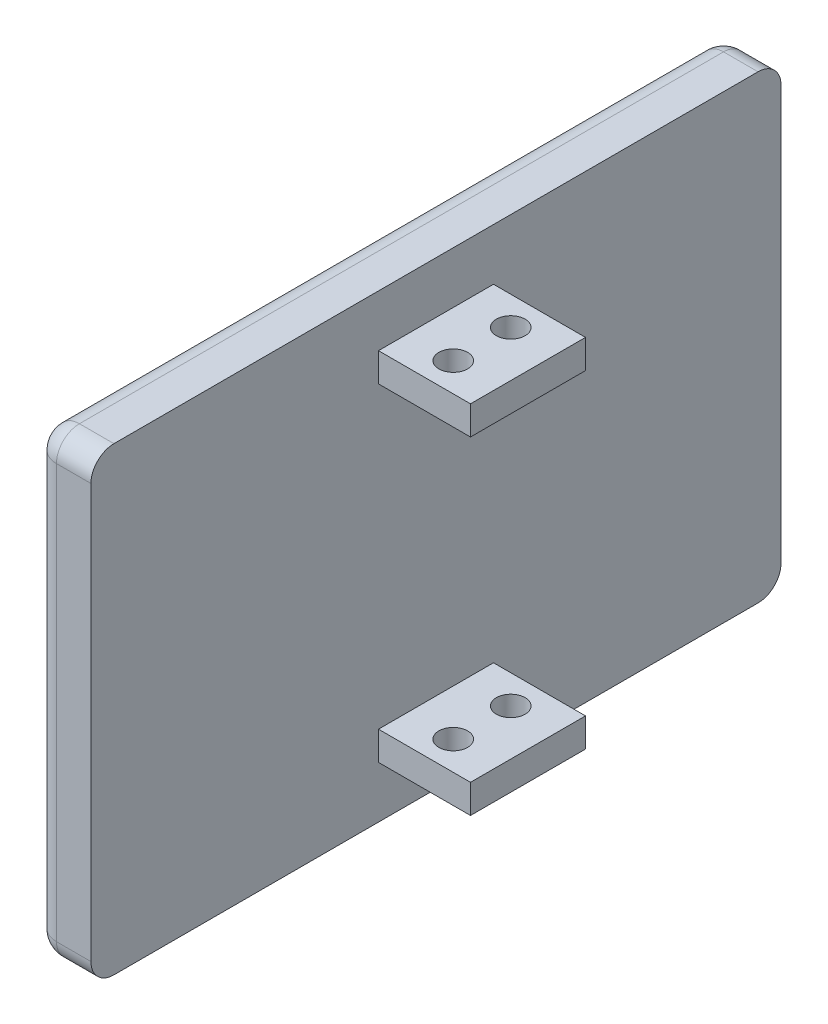
ISO-10303-21;
HEADER;
FILE_DESCRIPTION(('STEP AP214'),'2;1');
FILE_NAME('part.step','',(''),(''),'','','');
FILE_SCHEMA(('AUTOMOTIVE_DESIGN { 1 0 10303 214 1 1 1 1 }'));
ENDSEC;
DATA;
#1=APPLICATION_CONTEXT('core data for automotive mechanical design processes');
#2=APPLICATION_PROTOCOL_DEFINITION('international standard','automotive_design',2000,#1);
#3=PRODUCT_CONTEXT('',#1,'mechanical');
#4=PRODUCT('Part','Part','',(#3));
#5=PRODUCT_RELATED_PRODUCT_CATEGORY('part','',(#4));
#6=PRODUCT_DEFINITION_FORMATION('','',#4);
#7=PRODUCT_DEFINITION_CONTEXT('part definition',#1,'design');
#8=PRODUCT_DEFINITION('design','',#6,#7);
#9=PRODUCT_DEFINITION_SHAPE('','',#8);
#10=(LENGTH_UNIT() NAMED_UNIT(*) SI_UNIT(.MILLI.,.METRE.));
#11=(NAMED_UNIT(*) PLANE_ANGLE_UNIT() SI_UNIT($,.RADIAN.));
#12=(NAMED_UNIT(*) SI_UNIT($,.STERADIAN.) SOLID_ANGLE_UNIT());
#13=UNCERTAINTY_MEASURE_WITH_UNIT(LENGTH_MEASURE(1.E-05),#10,'distance_accuracy_value','');
#14=(GEOMETRIC_REPRESENTATION_CONTEXT(3) GLOBAL_UNCERTAINTY_ASSIGNED_CONTEXT((#13)) GLOBAL_UNIT_ASSIGNED_CONTEXT((#10,
#11,#12)) REPRESENTATION_CONTEXT('',''));
#15=CARTESIAN_POINT('',(0.,0.,0.));
#16=DIRECTION('',(0.,0.,1.));
#17=DIRECTION('',(1.,0.,0.));
#18=AXIS2_PLACEMENT_3D('',#15,#16,#17);
#19=CARTESIAN_POINT('',(6.35,0.,0.));
#20=DIRECTION('',(1.,0.,0.));
#21=DIRECTION('',(0.,0.,-1.));
#22=AXIS2_PLACEMENT_3D('',#19,#20,#21);
#23=PLANE('',#22);
#24=DIRECTION('',(0.,1.,0.));
#25=VECTOR('',#24,1.);
#26=CARTESIAN_POINT('',(6.35,-25.4,-38.1));
#27=LINE('',#26,#25);
#28=CARTESIAN_POINT('',(6.35,-22.86,-38.1));
#29=VERTEX_POINT('',#28);
#30=CARTESIAN_POINT('',(6.35,22.86,-38.1));
#31=VERTEX_POINT('',#30);
#32=EDGE_CURVE('E230',#29,#31,#27,.T.);
#33=ORIENTED_EDGE('',*,*,#32,.T.);
#34=CARTESIAN_POINT('',(6.35,22.86,-35.56));
#35=DIRECTION('',(1.,0.,0.));
#36=DIRECTION('',(0.,0.,-1.));
#37=AXIS2_PLACEMENT_3D('',#34,#35,#36);
#38=CIRCLE('',#37,2.54);
#39=CARTESIAN_POINT('',(6.35,25.4,-35.56));
#40=VERTEX_POINT('',#39);
#41=EDGE_CURVE('E11',#31,#40,#38,.T.);
#42=ORIENTED_EDGE('',*,*,#41,.T.);
#43=DIRECTION('',(0.,0.,1.));
#44=VECTOR('',#43,1.);
#45=CARTESIAN_POINT('',(6.35,25.4,-38.1));
#46=LINE('',#45,#44);
#47=CARTESIAN_POINT('',(6.35,25.4,35.56));
#48=VERTEX_POINT('',#47);
#49=EDGE_CURVE('E233',#40,#48,#46,.T.);
#50=ORIENTED_EDGE('',*,*,#49,.T.);
#51=CARTESIAN_POINT('',(6.35,22.86,35.56));
#52=DIRECTION('',(1.,0.,0.));
#53=DIRECTION('',(0.,0.,-1.));
#54=AXIS2_PLACEMENT_3D('',#51,#52,#53);
#55=CIRCLE('',#54,2.54);
#56=CARTESIAN_POINT('',(6.35,22.86,38.1));
#57=VERTEX_POINT('',#56);
#58=EDGE_CURVE('E268',#48,#57,#55,.T.);
#59=ORIENTED_EDGE('',*,*,#58,.T.);
#60=DIRECTION('',(0.,-1.,0.));
#61=VECTOR('',#60,1.);
#62=CARTESIAN_POINT('',(6.35,-25.4,38.1));
#63=LINE('',#62,#61);
#64=CARTESIAN_POINT('',(6.35,-22.86,38.1));
#65=VERTEX_POINT('',#64);
#66=EDGE_CURVE('E224',#57,#65,#63,.T.);
#67=ORIENTED_EDGE('',*,*,#66,.T.);
#68=CARTESIAN_POINT('',(6.35,-22.86,35.56));
#69=DIRECTION('',(1.,0.,0.));
#70=DIRECTION('',(0.,0.,-1.));
#71=AXIS2_PLACEMENT_3D('',#68,#69,#70);
#72=CIRCLE('',#71,2.54);
#73=CARTESIAN_POINT('',(6.35,-25.4,35.56));
#74=VERTEX_POINT('',#73);
#75=EDGE_CURVE('E270',#65,#74,#72,.T.);
#76=ORIENTED_EDGE('',*,*,#75,.T.);
#77=DIRECTION('',(0.,0.,-1.));
#78=VECTOR('',#77,1.);
#79=CARTESIAN_POINT('',(6.35,-25.4,-38.1));
#80=LINE('',#79,#78);
#81=CARTESIAN_POINT('',(6.35,-25.4,-35.56));
#82=VERTEX_POINT('',#81);
#83=EDGE_CURVE('E227',#74,#82,#80,.T.);
#84=ORIENTED_EDGE('',*,*,#83,.T.);
#85=CARTESIAN_POINT('',(6.35,-22.86,-35.56));
#86=DIRECTION('',(1.,0.,0.));
#87=DIRECTION('',(0.,0.,-1.));
#88=AXIS2_PLACEMENT_3D('',#85,#86,#87);
#89=CIRCLE('',#88,2.54);
#90=EDGE_CURVE('E48',#82,#29,#89,.T.);
#91=ORIENTED_EDGE('',*,*,#90,.T.);
#92=EDGE_LOOP('',(#33,#42,#50,#59,#67,#76,#84,#91));
#93=FACE_BOUND('',#92,.T.);
#94=DIRECTION('',(0.,0.,-1.));
#95=VECTOR('',#94,1.);
#96=CARTESIAN_POINT('',(6.35,-19.685,6.35000000000001));
#97=LINE('',#96,#95);
#98=CARTESIAN_POINT('',(6.35,-19.685,6.35000000000001));
#99=VERTEX_POINT('',#98);
#100=CARTESIAN_POINT('',(6.35,-19.685,-6.34999999999999));
#101=VERTEX_POINT('',#100);
#102=EDGE_CURVE('E193',#99,#101,#97,.T.);
#103=ORIENTED_EDGE('',*,*,#102,.F.);
#104=DIRECTION('',(0.,-1.,0.));
#105=VECTOR('',#104,1.);
#106=CARTESIAN_POINT('',(6.35,-19.685,6.35000000000001));
#107=LINE('',#106,#105);
#108=CARTESIAN_POINT('',(6.35,-16.51,6.35000000000001));
#109=VERTEX_POINT('',#108);
#110=EDGE_CURVE('E190',#109,#99,#107,.T.);
#111=ORIENTED_EDGE('',*,*,#110,.F.);
#112=DIRECTION('',(0.,0.,1.));
#113=VECTOR('',#112,1.);
#114=CARTESIAN_POINT('',(6.35,-16.51,6.35000000000001));
#115=LINE('',#114,#113);
#116=CARTESIAN_POINT('',(6.35,-16.51,-6.34999999999999));
#117=VERTEX_POINT('',#116);
#118=EDGE_CURVE('E203',#117,#109,#115,.T.);
#119=ORIENTED_EDGE('',*,*,#118,.F.);
#120=DIRECTION('',(0.,1.,0.));
#121=VECTOR('',#120,1.);
#122=CARTESIAN_POINT('',(6.35,-19.685,-6.34999999999999));
#123=LINE('',#122,#121);
#124=EDGE_CURVE('E211',#101,#117,#123,.T.);
#125=ORIENTED_EDGE('',*,*,#124,.F.);
#126=EDGE_LOOP('',(#103,#111,#119,#125));
#127=FACE_BOUND('',#126,.T.);
#128=DIRECTION('',(0.,0.,-1.));
#129=VECTOR('',#128,1.);
#130=CARTESIAN_POINT('',(6.35,16.51,6.35000000000001));
#131=LINE('',#130,#129);
#132=CARTESIAN_POINT('',(6.35,16.51,6.35000000000001));
#133=VERTEX_POINT('',#132);
#134=CARTESIAN_POINT('',(6.35,16.51,-6.34999999999999));
#135=VERTEX_POINT('',#134);
#136=EDGE_CURVE('E307',#133,#135,#131,.T.);
#137=ORIENTED_EDGE('',*,*,#136,.F.);
#138=DIRECTION('',(0.,-1.,0.));
#139=VECTOR('',#138,1.);
#140=CARTESIAN_POINT('',(6.35,19.685,6.35000000000001));
#141=LINE('',#140,#139);
#142=CARTESIAN_POINT('',(6.35,19.685,6.35000000000001));
#143=VERTEX_POINT('',#142);
#144=EDGE_CURVE('E188',#143,#133,#141,.T.);
#145=ORIENTED_EDGE('',*,*,#144,.F.);
#146=DIRECTION('',(0.,0.,1.));
#147=VECTOR('',#146,1.);
#148=CARTESIAN_POINT('',(6.35,19.685,6.35000000000001));
#149=LINE('',#148,#147);
#150=CARTESIAN_POINT('',(6.35,19.685,-6.34999999999999));
#151=VERTEX_POINT('',#150);
#152=EDGE_CURVE('E184',#151,#143,#149,.T.);
#153=ORIENTED_EDGE('',*,*,#152,.F.);
#154=DIRECTION('',(0.,1.,0.));
#155=VECTOR('',#154,1.);
#156=CARTESIAN_POINT('',(6.35,19.685,-6.34999999999999));
#157=LINE('',#156,#155);
#158=EDGE_CURVE('E309',#135,#151,#157,.T.);
#159=ORIENTED_EDGE('',*,*,#158,.F.);
#160=EDGE_LOOP('',(#137,#145,#153,#159));
#161=FACE_BOUND('',#160,.T.);
#162=ADVANCED_FACE('F39',(#93,#127,#161),#23,.T.);
#163=CARTESIAN_POINT('',(6.35,-25.4,38.1));
#164=DIRECTION('',(0.,0.,-1.));
#165=DIRECTION('',(-1.,0.,0.));
#166=AXIS2_PLACEMENT_3D('',#163,#164,#165);
#167=PLANE('',#166);
#168=DIRECTION('',(0.,-1.,0.));
#169=VECTOR('',#168,1.);
#170=CARTESIAN_POINT('',(2.54,-25.4,38.1));
#171=LINE('',#170,#169);
#172=CARTESIAN_POINT('',(2.54,22.86,38.1));
#173=VERTEX_POINT('',#172);
#174=CARTESIAN_POINT('',(2.54,-22.86,38.1));
#175=VERTEX_POINT('',#174);
#176=EDGE_CURVE('E56',#173,#175,#171,.T.);
#177=ORIENTED_EDGE('',*,*,#176,.T.);
#178=DIRECTION('',(-1.,0.,0.));
#179=VECTOR('',#178,1.);
#180=CARTESIAN_POINT('',(6.35,-22.86,38.1));
#181=LINE('',#180,#179);
#182=EDGE_CURVE('E266',#175,#65,#181,.F.);
#183=ORIENTED_EDGE('',*,*,#182,.T.);
#184=ORIENTED_EDGE('',*,*,#66,.F.);
#185=DIRECTION('',(-1.,0.,0.));
#186=VECTOR('',#185,1.);
#187=CARTESIAN_POINT('',(6.35,22.86,38.1));
#188=LINE('',#187,#186);
#189=EDGE_CURVE('E61',#57,#173,#188,.T.);
#190=ORIENTED_EDGE('',*,*,#189,.T.);
#191=EDGE_LOOP('',(#177,#183,#184,#190));
#192=FACE_BOUND('',#191,.T.);
#193=ADVANCED_FACE('F327',(#192),#167,.F.);
#194=CARTESIAN_POINT('',(6.35,-25.4,-38.1));
#195=DIRECTION('',(0.,1.,0.));
#196=DIRECTION('',(0.,0.,1.));
#197=AXIS2_PLACEMENT_3D('',#194,#195,#196);
#198=PLANE('',#197);
#199=DIRECTION('',(0.,0.,-1.));
#200=VECTOR('',#199,1.);
#201=CARTESIAN_POINT('',(2.54,-25.4,-38.1));
#202=LINE('',#201,#200);
#203=CARTESIAN_POINT('',(2.54,-25.4,35.56));
#204=VERTEX_POINT('',#203);
#205=CARTESIAN_POINT('',(2.54,-25.4,-35.56));
#206=VERTEX_POINT('',#205);
#207=EDGE_CURVE('E238',#204,#206,#202,.T.);
#208=ORIENTED_EDGE('',*,*,#207,.T.);
#209=DIRECTION('',(-1.,0.,0.));
#210=VECTOR('',#209,1.);
#211=CARTESIAN_POINT('',(6.35,-25.4,-35.56));
#212=LINE('',#211,#210);
#213=EDGE_CURVE('E241',#206,#82,#212,.F.);
#214=ORIENTED_EDGE('',*,*,#213,.T.);
#215=ORIENTED_EDGE('',*,*,#83,.F.);
#216=DIRECTION('',(-1.,0.,0.));
#217=VECTOR('',#216,1.);
#218=CARTESIAN_POINT('',(6.35,-25.4,35.56));
#219=LINE('',#218,#217);
#220=EDGE_CURVE('E236',#74,#204,#219,.T.);
#221=ORIENTED_EDGE('',*,*,#220,.T.);
#222=EDGE_LOOP('',(#208,#214,#215,#221));
#223=FACE_BOUND('',#222,.T.);
#224=ADVANCED_FACE('F333',(#223),#198,.F.);
#225=CARTESIAN_POINT('',(6.35,-25.4,-38.1));
#226=DIRECTION('',(0.,0.,1.));
#227=DIRECTION('',(1.,0.,0.));
#228=AXIS2_PLACEMENT_3D('',#225,#226,#227);
#229=PLANE('',#228);
#230=DIRECTION('',(0.,1.,0.));
#231=VECTOR('',#230,1.);
#232=CARTESIAN_POINT('',(2.54,-25.4,-38.1));
#233=LINE('',#232,#231);
#234=CARTESIAN_POINT('',(2.54,-22.86,-38.1));
#235=VERTEX_POINT('',#234);
#236=CARTESIAN_POINT('',(2.54,22.86,-38.1));
#237=VERTEX_POINT('',#236);
#238=EDGE_CURVE('E254',#235,#237,#233,.T.);
#239=ORIENTED_EDGE('',*,*,#238,.T.);
#240=DIRECTION('',(-1.,0.,0.));
#241=VECTOR('',#240,1.);
#242=CARTESIAN_POINT('',(6.35,22.86,-38.1));
#243=LINE('',#242,#241);
#244=EDGE_CURVE('E256',#237,#31,#243,.F.);
#245=ORIENTED_EDGE('',*,*,#244,.T.);
#246=ORIENTED_EDGE('',*,*,#32,.F.);
#247=DIRECTION('',(-1.,0.,0.));
#248=VECTOR('',#247,1.);
#249=CARTESIAN_POINT('',(6.35,-22.86,-38.1));
#250=LINE('',#249,#248);
#251=EDGE_CURVE('E252',#29,#235,#250,.T.);
#252=ORIENTED_EDGE('',*,*,#251,.T.);
#253=EDGE_LOOP('',(#239,#245,#246,#252));
#254=FACE_BOUND('',#253,.T.);
#255=ADVANCED_FACE('F347',(#254),#229,.F.);
#256=CARTESIAN_POINT('',(6.35,25.4,-38.1));
#257=DIRECTION('',(0.,-1.,0.));
#258=DIRECTION('',(0.,0.,-1.));
#259=AXIS2_PLACEMENT_3D('',#256,#257,#258);
#260=PLANE('',#259);
#261=ORIENTED_EDGE('',*,*,#49,.F.);
#262=DIRECTION('',(-1.,0.,0.));
#263=VECTOR('',#262,1.);
#264=CARTESIAN_POINT('',(6.35,25.4,-35.56));
#265=LINE('',#264,#263);
#266=CARTESIAN_POINT('',(2.54,25.4,-35.56));
#267=VERTEX_POINT('',#266);
#268=EDGE_CURVE('E262',#40,#267,#265,.T.);
#269=ORIENTED_EDGE('',*,*,#268,.T.);
#270=DIRECTION('',(0.,0.,1.));
#271=VECTOR('',#270,1.);
#272=CARTESIAN_POINT('',(2.54,25.4,-38.1));
#273=LINE('',#272,#271);
#274=CARTESIAN_POINT('',(2.54,25.4,35.56));
#275=VERTEX_POINT('',#274);
#276=EDGE_CURVE('E260',#267,#275,#273,.T.);
#277=ORIENTED_EDGE('',*,*,#276,.T.);
#278=DIRECTION('',(-1.,0.,0.));
#279=VECTOR('',#278,1.);
#280=CARTESIAN_POINT('',(6.35,25.4,35.56));
#281=LINE('',#280,#279);
#282=EDGE_CURVE('E258',#275,#48,#281,.F.);
#283=ORIENTED_EDGE('',*,*,#282,.T.);
#284=EDGE_LOOP('',(#261,#269,#277,#283));
#285=FACE_BOUND('',#284,.T.);
#286=ADVANCED_FACE('F343',(#285),#260,.F.);
#287=CARTESIAN_POINT('',(0.,0.,0.));
#288=DIRECTION('',(1.,0.,0.));
#289=DIRECTION('',(0.,0.,-1.));
#290=AXIS2_PLACEMENT_3D('',#287,#288,#289);
#291=PLANE('',#290);
#292=DIRECTION('',(0.,1.,0.));
#293=VECTOR('',#292,1.);
#294=CARTESIAN_POINT('',(0.,0.,-35.56));
#295=LINE('',#294,#293);
#296=CARTESIAN_POINT('',(0.,22.86,-35.56));
#297=VERTEX_POINT('',#296);
#298=CARTESIAN_POINT('',(0.,-22.86,-35.56));
#299=VERTEX_POINT('',#298);
#300=EDGE_CURVE('E247',#297,#299,#295,.F.);
#301=ORIENTED_EDGE('',*,*,#300,.T.);
#302=DIRECTION('',(0.,0.,-1.));
#303=VECTOR('',#302,1.);
#304=CARTESIAN_POINT('',(0.,-22.86,0.));
#305=LINE('',#304,#303);
#306=CARTESIAN_POINT('',(0.,-22.86,35.56));
#307=VERTEX_POINT('',#306);
#308=EDGE_CURVE('E249',#299,#307,#305,.F.);
#309=ORIENTED_EDGE('',*,*,#308,.T.);
#310=DIRECTION('',(0.,-1.,0.));
#311=VECTOR('',#310,1.);
#312=CARTESIAN_POINT('',(0.,0.,35.56));
#313=LINE('',#312,#311);
#314=CARTESIAN_POINT('',(0.,22.86,35.56));
#315=VERTEX_POINT('',#314);
#316=EDGE_CURVE('E243',#307,#315,#313,.F.);
#317=ORIENTED_EDGE('',*,*,#316,.T.);
#318=DIRECTION('',(0.,0.,1.));
#319=VECTOR('',#318,1.);
#320=CARTESIAN_POINT('',(0.,22.86,0.));
#321=LINE('',#320,#319);
#322=EDGE_CURVE('E245',#315,#297,#321,.F.);
#323=ORIENTED_EDGE('',*,*,#322,.T.);
#324=EDGE_LOOP('',(#301,#309,#317,#323));
#325=FACE_BOUND('',#324,.T.);
#326=ADVANCED_FACE('F340',(#325),#291,.F.);
#327=CARTESIAN_POINT('',(16.51,-19.685,6.35000000000001));
#328=DIRECTION('',(0.,0.,-1.));
#329=DIRECTION('',(-1.,0.,0.));
#330=AXIS2_PLACEMENT_3D('',#327,#328,#329);
#331=PLANE('',#330);
#332=ORIENTED_EDGE('',*,*,#110,.T.);
#333=DIRECTION('',(-1.,0.,0.));
#334=VECTOR('',#333,1.);
#335=CARTESIAN_POINT('',(16.51,-19.685,6.35000000000001));
#336=LINE('',#335,#334);
#337=CARTESIAN_POINT('',(16.51,-19.685,6.35000000000001));
#338=VERTEX_POINT('',#337);
#339=EDGE_CURVE('E222',#338,#99,#336,.T.);
#340=ORIENTED_EDGE('',*,*,#339,.F.);
#341=DIRECTION('',(0.,-1.,0.));
#342=VECTOR('',#341,1.);
#343=CARTESIAN_POINT('',(16.51,-19.685,6.35000000000001));
#344=LINE('',#343,#342);
#345=CARTESIAN_POINT('',(16.51,-16.51,6.35000000000001));
#346=VERTEX_POINT('',#345);
#347=EDGE_CURVE('E199',#346,#338,#344,.T.);
#348=ORIENTED_EDGE('',*,*,#347,.F.);
#349=DIRECTION('',(-1.,0.,0.));
#350=VECTOR('',#349,1.);
#351=CARTESIAN_POINT('',(16.51,-16.51,6.35000000000001));
#352=LINE('',#351,#350);
#353=EDGE_CURVE('E208',#346,#109,#352,.T.);
#354=ORIENTED_EDGE('',*,*,#353,.T.);
#355=EDGE_LOOP('',(#332,#340,#348,#354));
#356=FACE_BOUND('',#355,.T.);
#357=ADVANCED_FACE('F338',(#356),#331,.F.);
#358=CARTESIAN_POINT('',(16.51,-19.685,6.35000000000001));
#359=DIRECTION('',(0.,1.,0.));
#360=DIRECTION('',(0.,0.,1.));
#361=AXIS2_PLACEMENT_3D('',#358,#359,#360);
#362=PLANE('',#361);
#363=CARTESIAN_POINT('',(11.43,-19.685,3.175));
#364=DIRECTION('',(0.,1.,0.));
#365=DIRECTION('',(0.,0.,1.));
#366=AXIS2_PLACEMENT_3D('',#363,#364,#365);
#367=CIRCLE('',#366,1.5875);
#368=CARTESIAN_POINT('',(11.43,-19.685,4.7625));
#369=VERTEX_POINT('',#368);
#370=EDGE_CURVE('E471',#369,#369,#367,.F.);
#371=ORIENTED_EDGE('',*,*,#370,.F.);
#372=EDGE_LOOP('',(#371));
#373=FACE_BOUND('',#372,.T.);
#374=CARTESIAN_POINT('',(11.43,-19.685,-3.175));
#375=DIRECTION('',(0.,1.,0.));
#376=DIRECTION('',(0.,0.,1.));
#377=AXIS2_PLACEMENT_3D('',#374,#375,#376);
#378=CIRCLE('',#377,1.5875);
#379=CARTESIAN_POINT('',(11.43,-19.685,-1.5875));
#380=VERTEX_POINT('',#379);
#381=EDGE_CURVE('E475',#380,#380,#378,.F.);
#382=ORIENTED_EDGE('',*,*,#381,.F.);
#383=EDGE_LOOP('',(#382));
#384=FACE_BOUND('',#383,.T.);
#385=ORIENTED_EDGE('',*,*,#102,.T.);
#386=DIRECTION('',(-1.,0.,0.));
#387=VECTOR('',#386,1.);
#388=CARTESIAN_POINT('',(16.51,-19.685,-6.34999999999999));
#389=LINE('',#388,#387);
#390=CARTESIAN_POINT('',(16.51,-19.685,-6.34999999999999));
#391=VERTEX_POINT('',#390);
#392=EDGE_CURVE('E219',#391,#101,#389,.T.);
#393=ORIENTED_EDGE('',*,*,#392,.F.);
#394=DIRECTION('',(0.,0.,-1.));
#395=VECTOR('',#394,1.);
#396=CARTESIAN_POINT('',(16.51,-19.685,6.35000000000001));
#397=LINE('',#396,#395);
#398=EDGE_CURVE('E202',#338,#391,#397,.T.);
#399=ORIENTED_EDGE('',*,*,#398,.F.);
#400=ORIENTED_EDGE('',*,*,#339,.T.);
#401=EDGE_LOOP('',(#385,#393,#399,#400));
#402=FACE_BOUND('',#401,.T.);
#403=ADVANCED_FACE('F460',(#373,#384,#402),#362,.F.);
#404=CARTESIAN_POINT('',(16.51,-19.685,-6.34999999999999));
#405=DIRECTION('',(0.,0.,1.));
#406=DIRECTION('',(1.,0.,0.));
#407=AXIS2_PLACEMENT_3D('',#404,#405,#406);
#408=PLANE('',#407);
#409=ORIENTED_EDGE('',*,*,#124,.T.);
#410=DIRECTION('',(-1.,0.,0.));
#411=VECTOR('',#410,1.);
#412=CARTESIAN_POINT('',(16.51,-16.51,-6.34999999999999));
#413=LINE('',#412,#411);
#414=CARTESIAN_POINT('',(16.51,-16.51,-6.34999999999999));
#415=VERTEX_POINT('',#414);
#416=EDGE_CURVE('E217',#415,#117,#413,.T.);
#417=ORIENTED_EDGE('',*,*,#416,.F.);
#418=DIRECTION('',(0.,1.,0.));
#419=VECTOR('',#418,1.);
#420=CARTESIAN_POINT('',(16.51,-19.685,-6.34999999999999));
#421=LINE('',#420,#419);
#422=EDGE_CURVE('E205',#391,#415,#421,.T.);
#423=ORIENTED_EDGE('',*,*,#422,.F.);
#424=ORIENTED_EDGE('',*,*,#392,.T.);
#425=EDGE_LOOP('',(#409,#417,#423,#424));
#426=FACE_BOUND('',#425,.T.);
#427=ADVANCED_FACE('F457',(#426),#408,.F.);
#428=CARTESIAN_POINT('',(16.51,-16.51,6.35000000000001));
#429=DIRECTION('',(0.,-1.,0.));
#430=DIRECTION('',(0.,0.,-1.));
#431=AXIS2_PLACEMENT_3D('',#428,#429,#430);
#432=PLANE('',#431);
#433=CARTESIAN_POINT('',(11.43,-16.51,3.175));
#434=DIRECTION('',(0.,-1.,0.));
#435=DIRECTION('',(0.,0.,-1.));
#436=AXIS2_PLACEMENT_3D('',#433,#434,#435);
#437=CIRCLE('',#436,1.5875);
#438=CARTESIAN_POINT('',(11.43,-16.51,1.5875));
#439=VERTEX_POINT('',#438);
#440=EDGE_CURVE('E276',#439,#439,#437,.T.);
#441=ORIENTED_EDGE('',*,*,#440,.T.);
#442=EDGE_LOOP('',(#441));
#443=FACE_BOUND('',#442,.T.);
#444=CARTESIAN_POINT('',(11.43,-16.51,-3.175));
#445=DIRECTION('',(0.,-1.,0.));
#446=DIRECTION('',(0.,0.,-1.));
#447=AXIS2_PLACEMENT_3D('',#444,#445,#446);
#448=CIRCLE('',#447,1.5875);
#449=CARTESIAN_POINT('',(11.43,-16.51,-4.7625));
#450=VERTEX_POINT('',#449);
#451=EDGE_CURVE('E501',#450,#450,#448,.T.);
#452=ORIENTED_EDGE('',*,*,#451,.T.);
#453=EDGE_LOOP('',(#452));
#454=FACE_BOUND('',#453,.T.);
#455=ORIENTED_EDGE('',*,*,#118,.T.);
#456=ORIENTED_EDGE('',*,*,#353,.F.);
#457=DIRECTION('',(0.,0.,1.));
#458=VECTOR('',#457,1.);
#459=CARTESIAN_POINT('',(16.51,-16.51,6.35000000000001));
#460=LINE('',#459,#458);
#461=EDGE_CURVE('E207',#415,#346,#460,.T.);
#462=ORIENTED_EDGE('',*,*,#461,.F.);
#463=ORIENTED_EDGE('',*,*,#416,.T.);
#464=EDGE_LOOP('',(#455,#456,#462,#463));
#465=FACE_BOUND('',#464,.T.);
#466=ADVANCED_FACE('F453',(#443,#454,#465),#432,.F.);
#467=CARTESIAN_POINT('',(16.51,0.,0.));
#468=DIRECTION('',(-1.,0.,0.));
#469=DIRECTION('',(0.,0.,1.));
#470=AXIS2_PLACEMENT_3D('',#467,#468,#469);
#471=PLANE('',#470);
#472=ORIENTED_EDGE('',*,*,#347,.T.);
#473=ORIENTED_EDGE('',*,*,#398,.T.);
#474=ORIENTED_EDGE('',*,*,#422,.T.);
#475=ORIENTED_EDGE('',*,*,#461,.T.);
#476=EDGE_LOOP('',(#472,#473,#474,#475));
#477=FACE_BOUND('',#476,.T.);
#478=ADVANCED_FACE('F450',(#477),#471,.F.);
#479=CARTESIAN_POINT('',(16.51,19.685,6.35000000000001));
#480=DIRECTION('',(0.,0.,-1.));
#481=DIRECTION('',(-1.,0.,0.));
#482=AXIS2_PLACEMENT_3D('',#479,#480,#481);
#483=PLANE('',#482);
#484=ORIENTED_EDGE('',*,*,#144,.T.);
#485=DIRECTION('',(-1.,0.,0.));
#486=VECTOR('',#485,1.);
#487=CARTESIAN_POINT('',(16.51,16.51,6.35000000000001));
#488=LINE('',#487,#486);
#489=CARTESIAN_POINT('',(16.51,16.51,6.35000000000001));
#490=VERTEX_POINT('',#489);
#491=EDGE_CURVE('E168',#490,#133,#488,.T.);
#492=ORIENTED_EDGE('',*,*,#491,.F.);
#493=DIRECTION('',(0.,-1.,0.));
#494=VECTOR('',#493,1.);
#495=CARTESIAN_POINT('',(16.51,19.685,6.35000000000001));
#496=LINE('',#495,#494);
#497=CARTESIAN_POINT('',(16.51,19.685,6.35000000000001));
#498=VERTEX_POINT('',#497);
#499=EDGE_CURVE('E175',#498,#490,#496,.T.);
#500=ORIENTED_EDGE('',*,*,#499,.F.);
#501=DIRECTION('',(-1.,0.,0.));
#502=VECTOR('',#501,1.);
#503=CARTESIAN_POINT('',(16.51,19.685,6.35000000000001));
#504=LINE('',#503,#502);
#505=EDGE_CURVE('E317',#498,#143,#504,.T.);
#506=ORIENTED_EDGE('',*,*,#505,.T.);
#507=EDGE_LOOP('',(#484,#492,#500,#506));
#508=FACE_BOUND('',#507,.T.);
#509=ADVANCED_FACE('F186',(#508),#483,.F.);
#510=CARTESIAN_POINT('',(16.51,16.51,6.35000000000001));
#511=DIRECTION('',(0.,1.,0.));
#512=DIRECTION('',(0.,0.,1.));
#513=AXIS2_PLACEMENT_3D('',#510,#511,#512);
#514=PLANE('',#513);
#515=CARTESIAN_POINT('',(11.43,16.51,3.175));
#516=DIRECTION('',(0.,1.,0.));
#517=DIRECTION('',(0.,0.,1.));
#518=AXIS2_PLACEMENT_3D('',#515,#516,#517);
#519=CIRCLE('',#518,1.5875);
#520=CARTESIAN_POINT('',(11.43,16.51,4.7625));
#521=VERTEX_POINT('',#520);
#522=EDGE_CURVE('E504',#521,#521,#519,.T.);
#523=ORIENTED_EDGE('',*,*,#522,.T.);
#524=EDGE_LOOP('',(#523));
#525=FACE_BOUND('',#524,.T.);
#526=CARTESIAN_POINT('',(11.43,16.51,-3.175));
#527=DIRECTION('',(0.,1.,0.));
#528=DIRECTION('',(0.,0.,1.));
#529=AXIS2_PLACEMENT_3D('',#526,#527,#528);
#530=CIRCLE('',#529,1.5875);
#531=CARTESIAN_POINT('',(11.43,16.51,-1.5875));
#532=VERTEX_POINT('',#531);
#533=EDGE_CURVE('E498',#532,#532,#530,.T.);
#534=ORIENTED_EDGE('',*,*,#533,.T.);
#535=EDGE_LOOP('',(#534));
#536=FACE_BOUND('',#535,.T.);
#537=ORIENTED_EDGE('',*,*,#136,.T.);
#538=DIRECTION('',(-1.,0.,0.));
#539=VECTOR('',#538,1.);
#540=CARTESIAN_POINT('',(16.51,16.51,-6.34999999999999));
#541=LINE('',#540,#539);
#542=CARTESIAN_POINT('',(16.51,16.51,-6.34999999999999));
#543=VERTEX_POINT('',#542);
#544=EDGE_CURVE('E171',#543,#135,#541,.T.);
#545=ORIENTED_EDGE('',*,*,#544,.F.);
#546=DIRECTION('',(0.,0.,-1.));
#547=VECTOR('',#546,1.);
#548=CARTESIAN_POINT('',(16.51,16.51,6.35000000000001));
#549=LINE('',#548,#547);
#550=EDGE_CURVE('E164',#490,#543,#549,.T.);
#551=ORIENTED_EDGE('',*,*,#550,.F.);
#552=ORIENTED_EDGE('',*,*,#491,.T.);
#553=EDGE_LOOP('',(#537,#545,#551,#552));
#554=FACE_BOUND('',#553,.T.);
#555=ADVANCED_FACE('F166',(#525,#536,#554),#514,.F.);
#556=CARTESIAN_POINT('',(16.51,19.685,-6.34999999999999));
#557=DIRECTION('',(0.,0.,1.));
#558=DIRECTION('',(1.,0.,0.));
#559=AXIS2_PLACEMENT_3D('',#556,#557,#558);
#560=PLANE('',#559);
#561=ORIENTED_EDGE('',*,*,#158,.T.);
#562=DIRECTION('',(-1.,0.,0.));
#563=VECTOR('',#562,1.);
#564=CARTESIAN_POINT('',(16.51,19.685,-6.34999999999999));
#565=LINE('',#564,#563);
#566=CARTESIAN_POINT('',(16.51,19.685,-6.34999999999999));
#567=VERTEX_POINT('',#566);
#568=EDGE_CURVE('E195',#567,#151,#565,.T.);
#569=ORIENTED_EDGE('',*,*,#568,.F.);
#570=DIRECTION('',(0.,1.,0.));
#571=VECTOR('',#570,1.);
#572=CARTESIAN_POINT('',(16.51,19.685,-6.34999999999999));
#573=LINE('',#572,#571);
#574=EDGE_CURVE('E174',#543,#567,#573,.T.);
#575=ORIENTED_EDGE('',*,*,#574,.F.);
#576=ORIENTED_EDGE('',*,*,#544,.T.);
#577=EDGE_LOOP('',(#561,#569,#575,#576));
#578=FACE_BOUND('',#577,.T.);
#579=ADVANCED_FACE('F324',(#578),#560,.F.);
#580=CARTESIAN_POINT('',(16.51,19.685,6.35000000000001));
#581=DIRECTION('',(0.,-1.,0.));
#582=DIRECTION('',(0.,0.,-1.));
#583=AXIS2_PLACEMENT_3D('',#580,#581,#582);
#584=PLANE('',#583);
#585=CARTESIAN_POINT('',(11.43,19.685,3.175));
#586=DIRECTION('',(0.,1.,0.));
#587=DIRECTION('',(0.,0.,1.));
#588=AXIS2_PLACEMENT_3D('',#585,#586,#587);
#589=CIRCLE('',#588,1.5875);
#590=CARTESIAN_POINT('',(11.43,19.685,4.7625));
#591=VERTEX_POINT('',#590);
#592=EDGE_CURVE('E489',#591,#591,#589,.T.);
#593=ORIENTED_EDGE('',*,*,#592,.F.);
#594=EDGE_LOOP('',(#593));
#595=FACE_BOUND('',#594,.T.);
#596=CARTESIAN_POINT('',(11.43,19.685,-3.175));
#597=DIRECTION('',(0.,1.,0.));
#598=DIRECTION('',(0.,0.,1.));
#599=AXIS2_PLACEMENT_3D('',#596,#597,#598);
#600=CIRCLE('',#599,1.5875);
#601=CARTESIAN_POINT('',(11.43,19.685,-1.5875));
#602=VERTEX_POINT('',#601);
#603=EDGE_CURVE('E490',#602,#602,#600,.T.);
#604=ORIENTED_EDGE('',*,*,#603,.F.);
#605=EDGE_LOOP('',(#604));
#606=FACE_BOUND('',#605,.T.);
#607=ORIENTED_EDGE('',*,*,#152,.T.);
#608=ORIENTED_EDGE('',*,*,#505,.F.);
#609=DIRECTION('',(0.,0.,1.));
#610=VECTOR('',#609,1.);
#611=CARTESIAN_POINT('',(16.51,19.685,6.35000000000001));
#612=LINE('',#611,#610);
#613=EDGE_CURVE('E180',#567,#498,#612,.T.);
#614=ORIENTED_EDGE('',*,*,#613,.F.);
#615=ORIENTED_EDGE('',*,*,#568,.T.);
#616=EDGE_LOOP('',(#607,#608,#614,#615));
#617=FACE_BOUND('',#616,.T.);
#618=ADVANCED_FACE('F320',(#595,#606,#617),#584,.F.);
#619=CARTESIAN_POINT('',(16.51,0.,0.));
#620=DIRECTION('',(1.,0.,0.));
#621=DIRECTION('',(0.,0.,-1.));
#622=AXIS2_PLACEMENT_3D('',#619,#620,#621);
#623=PLANE('',#622);
#624=ORIENTED_EDGE('',*,*,#499,.T.);
#625=ORIENTED_EDGE('',*,*,#550,.T.);
#626=ORIENTED_EDGE('',*,*,#574,.T.);
#627=ORIENTED_EDGE('',*,*,#613,.T.);
#628=EDGE_LOOP('',(#624,#625,#626,#627));
#629=FACE_BOUND('',#628,.T.);
#630=ADVANCED_FACE('F178',(#629),#623,.T.);
#631=CARTESIAN_POINT('',(6.35,22.86,35.56));
#632=DIRECTION('',(-1.,0.,0.));
#633=DIRECTION('',(0.,0.,1.));
#634=AXIS2_PLACEMENT_3D('',#631,#632,#633);
#635=CYLINDRICAL_SURFACE('',#634,2.54);
#636=ORIENTED_EDGE('',*,*,#58,.F.);
#637=ORIENTED_EDGE('',*,*,#282,.F.);
#638=CARTESIAN_POINT('',(2.54,22.86,35.56));
#639=DIRECTION('',(-1.,0.,0.));
#640=DIRECTION('',(0.,0.,1.));
#641=AXIS2_PLACEMENT_3D('',#638,#639,#640);
#642=CIRCLE('',#641,2.54);
#643=EDGE_CURVE('E301',#173,#275,#642,.T.);
#644=ORIENTED_EDGE('',*,*,#643,.F.);
#645=ORIENTED_EDGE('',*,*,#189,.F.);
#646=EDGE_LOOP('',(#636,#637,#644,#645));
#647=FACE_BOUND('',#646,.T.);
#648=ADVANCED_FACE('F41',(#647),#635,.T.);
#649=CARTESIAN_POINT('',(6.35,22.86,-35.56));
#650=DIRECTION('',(-1.,0.,0.));
#651=DIRECTION('',(0.,0.,1.));
#652=AXIS2_PLACEMENT_3D('',#649,#650,#651);
#653=CYLINDRICAL_SURFACE('',#652,2.54);
#654=ORIENTED_EDGE('',*,*,#41,.F.);
#655=ORIENTED_EDGE('',*,*,#244,.F.);
#656=CARTESIAN_POINT('',(2.54,22.86,-35.56));
#657=DIRECTION('',(-1.,0.,0.));
#658=DIRECTION('',(0.,0.,1.));
#659=AXIS2_PLACEMENT_3D('',#656,#657,#658);
#660=CIRCLE('',#659,2.54);
#661=EDGE_CURVE('E299',#267,#237,#660,.T.);
#662=ORIENTED_EDGE('',*,*,#661,.F.);
#663=ORIENTED_EDGE('',*,*,#268,.F.);
#664=EDGE_LOOP('',(#654,#655,#662,#663));
#665=FACE_BOUND('',#664,.T.);
#666=ADVANCED_FACE('F393',(#665),#653,.T.);
#667=CARTESIAN_POINT('',(2.54,22.86,-38.1));
#668=DIRECTION('',(0.,0.,1.));
#669=DIRECTION('',(0.,-1.,0.));
#670=AXIS2_PLACEMENT_3D('',#667,#668,#669);
#671=CYLINDRICAL_SURFACE('',#670,2.54);
#672=CARTESIAN_POINT('',(2.54,22.86,35.56));
#673=DIRECTION('',(0.,0.,1.));
#674=DIRECTION('',(1.,0.,0.));
#675=AXIS2_PLACEMENT_3D('',#672,#673,#674);
#676=CIRCLE('',#675,2.54);
#677=EDGE_CURVE('E43',#275,#315,#676,.T.);
#678=ORIENTED_EDGE('',*,*,#677,.F.);
#679=ORIENTED_EDGE('',*,*,#276,.F.);
#680=CARTESIAN_POINT('',(2.54,22.86,-35.56));
#681=DIRECTION('',(0.,0.,-1.));
#682=DIRECTION('',(-1.,0.,0.));
#683=AXIS2_PLACEMENT_3D('',#680,#681,#682);
#684=CIRCLE('',#683,2.54);
#685=EDGE_CURVE('E296',#297,#267,#684,.T.);
#686=ORIENTED_EDGE('',*,*,#685,.F.);
#687=ORIENTED_EDGE('',*,*,#322,.F.);
#688=EDGE_LOOP('',(#678,#679,#686,#687));
#689=FACE_BOUND('',#688,.T.);
#690=ADVANCED_FACE('F391',(#689),#671,.T.);
#691=CARTESIAN_POINT('',(2.54,22.86,35.56));
#692=DIRECTION('',(0.,1.,0.));
#693=DIRECTION('',(0.,0.,1.));
#694=AXIS2_PLACEMENT_3D('',#691,#692,#693);
#695=SPHERICAL_SURFACE('',#694,2.54);
#696=ORIENTED_EDGE('',*,*,#643,.T.);
#697=ORIENTED_EDGE('',*,*,#677,.T.);
#698=CARTESIAN_POINT('',(2.54,22.86,35.56));
#699=DIRECTION('',(0.,1.,0.));
#700=DIRECTION('',(0.,0.,1.));
#701=AXIS2_PLACEMENT_3D('',#698,#699,#700);
#702=CIRCLE('',#701,2.54);
#703=EDGE_CURVE('E293',#173,#315,#702,.F.);
#704=ORIENTED_EDGE('',*,*,#703,.F.);
#705=EDGE_LOOP('',(#696,#697,#704));
#706=FACE_BOUND('',#705,.T.);
#707=ADVANCED_FACE('F387',(#706),#695,.T.);
#708=CARTESIAN_POINT('',(2.54,22.86,-35.56));
#709=DIRECTION('',(0.,1.,0.));
#710=DIRECTION('',(0.,0.,1.));
#711=AXIS2_PLACEMENT_3D('',#708,#709,#710);
#712=SPHERICAL_SURFACE('',#711,2.54);
#713=ORIENTED_EDGE('',*,*,#685,.T.);
#714=ORIENTED_EDGE('',*,*,#661,.T.);
#715=CARTESIAN_POINT('',(2.54,22.86,-35.56));
#716=DIRECTION('',(0.,1.,0.));
#717=DIRECTION('',(0.,0.,1.));
#718=AXIS2_PLACEMENT_3D('',#715,#716,#717);
#719=CIRCLE('',#718,2.54);
#720=EDGE_CURVE('E290',#297,#237,#719,.F.);
#721=ORIENTED_EDGE('',*,*,#720,.F.);
#722=EDGE_LOOP('',(#713,#714,#721));
#723=FACE_BOUND('',#722,.T.);
#724=ADVANCED_FACE('F383',(#723),#712,.T.);
#725=CARTESIAN_POINT('',(2.54,-25.4,35.56));
#726=DIRECTION('',(0.,-1.,0.));
#727=DIRECTION('',(0.,0.,-1.));
#728=AXIS2_PLACEMENT_3D('',#725,#726,#727);
#729=CYLINDRICAL_SURFACE('',#728,2.54);
#730=ORIENTED_EDGE('',*,*,#703,.T.);
#731=ORIENTED_EDGE('',*,*,#316,.F.);
#732=CARTESIAN_POINT('',(2.54,-22.86,35.56));
#733=DIRECTION('',(0.,-1.,0.));
#734=DIRECTION('',(0.,0.,-1.));
#735=AXIS2_PLACEMENT_3D('',#732,#733,#734);
#736=CIRCLE('',#735,2.54);
#737=EDGE_CURVE('E287',#175,#307,#736,.T.);
#738=ORIENTED_EDGE('',*,*,#737,.F.);
#739=ORIENTED_EDGE('',*,*,#176,.F.);
#740=EDGE_LOOP('',(#730,#731,#738,#739));
#741=FACE_BOUND('',#740,.T.);
#742=ADVANCED_FACE('F379',(#741),#729,.T.);
#743=CARTESIAN_POINT('',(6.35,-22.86,35.56));
#744=DIRECTION('',(-1.,0.,0.));
#745=DIRECTION('',(0.,0.,1.));
#746=AXIS2_PLACEMENT_3D('',#743,#744,#745);
#747=CYLINDRICAL_SURFACE('',#746,2.54);
#748=ORIENTED_EDGE('',*,*,#75,.F.);
#749=ORIENTED_EDGE('',*,*,#182,.F.);
#750=CARTESIAN_POINT('',(2.54,-22.86,35.56));
#751=DIRECTION('',(-1.,0.,0.));
#752=DIRECTION('',(0.,0.,1.));
#753=AXIS2_PLACEMENT_3D('',#750,#751,#752);
#754=CIRCLE('',#753,2.54);
#755=EDGE_CURVE('E284',#204,#175,#754,.T.);
#756=ORIENTED_EDGE('',*,*,#755,.F.);
#757=ORIENTED_EDGE('',*,*,#220,.F.);
#758=EDGE_LOOP('',(#748,#749,#756,#757));
#759=FACE_BOUND('',#758,.T.);
#760=ADVANCED_FACE('F375',(#759),#747,.T.);
#761=CARTESIAN_POINT('',(6.35,-22.86,-35.56));
#762=DIRECTION('',(-1.,0.,0.));
#763=DIRECTION('',(0.,0.,1.));
#764=AXIS2_PLACEMENT_3D('',#761,#762,#763);
#765=CYLINDRICAL_SURFACE('',#764,2.54);
#766=ORIENTED_EDGE('',*,*,#90,.F.);
#767=ORIENTED_EDGE('',*,*,#213,.F.);
#768=CARTESIAN_POINT('',(2.54,-22.86,-35.56));
#769=DIRECTION('',(-1.,0.,0.));
#770=DIRECTION('',(0.,0.,1.));
#771=AXIS2_PLACEMENT_3D('',#768,#769,#770);
#772=CIRCLE('',#771,2.54);
#773=EDGE_CURVE('E281',#235,#206,#772,.T.);
#774=ORIENTED_EDGE('',*,*,#773,.F.);
#775=ORIENTED_EDGE('',*,*,#251,.F.);
#776=EDGE_LOOP('',(#766,#767,#774,#775));
#777=FACE_BOUND('',#776,.T.);
#778=ADVANCED_FACE('F371',(#777),#765,.T.);
#779=CARTESIAN_POINT('',(2.54,-25.4,-35.56));
#780=DIRECTION('',(0.,1.,0.));
#781=DIRECTION('',(0.,0.,1.));
#782=AXIS2_PLACEMENT_3D('',#779,#780,#781);
#783=CYLINDRICAL_SURFACE('',#782,2.54);
#784=ORIENTED_EDGE('',*,*,#720,.T.);
#785=ORIENTED_EDGE('',*,*,#238,.F.);
#786=CARTESIAN_POINT('',(2.54,-22.86,-35.56));
#787=DIRECTION('',(0.,-1.,0.));
#788=DIRECTION('',(0.,0.,-1.));
#789=AXIS2_PLACEMENT_3D('',#786,#787,#788);
#790=CIRCLE('',#789,2.54);
#791=EDGE_CURVE('E278',#299,#235,#790,.T.);
#792=ORIENTED_EDGE('',*,*,#791,.F.);
#793=ORIENTED_EDGE('',*,*,#300,.F.);
#794=EDGE_LOOP('',(#784,#785,#792,#793));
#795=FACE_BOUND('',#794,.T.);
#796=ADVANCED_FACE('F367',(#795),#783,.T.);
#797=CARTESIAN_POINT('',(2.54,-22.86,35.56));
#798=DIRECTION('',(0.,0.,1.));
#799=DIRECTION('',(1.,0.,0.));
#800=AXIS2_PLACEMENT_3D('',#797,#798,#799);
#801=SPHERICAL_SURFACE('',#800,2.54);
#802=ORIENTED_EDGE('',*,*,#755,.T.);
#803=ORIENTED_EDGE('',*,*,#737,.T.);
#804=CARTESIAN_POINT('',(2.54,-22.86,35.56));
#805=DIRECTION('',(0.,0.,1.));
#806=DIRECTION('',(1.,0.,0.));
#807=AXIS2_PLACEMENT_3D('',#804,#805,#806);
#808=CIRCLE('',#807,2.54);
#809=EDGE_CURVE('E275',#204,#307,#808,.F.);
#810=ORIENTED_EDGE('',*,*,#809,.F.);
#811=EDGE_LOOP('',(#802,#803,#810));
#812=FACE_BOUND('',#811,.T.);
#813=ADVANCED_FACE('F363',(#812),#801,.T.);
#814=CARTESIAN_POINT('',(2.54,-22.86,-35.56));
#815=DIRECTION('',(0.,0.,-1.));
#816=DIRECTION('',(-1.,0.,0.));
#817=AXIS2_PLACEMENT_3D('',#814,#815,#816);
#818=SPHERICAL_SURFACE('',#817,2.54);
#819=ORIENTED_EDGE('',*,*,#791,.T.);
#820=ORIENTED_EDGE('',*,*,#773,.T.);
#821=CARTESIAN_POINT('',(2.54,-22.86,-35.56));
#822=DIRECTION('',(0.,0.,-1.));
#823=DIRECTION('',(-1.,0.,0.));
#824=AXIS2_PLACEMENT_3D('',#821,#822,#823);
#825=CIRCLE('',#824,2.54);
#826=EDGE_CURVE('E273',#299,#206,#825,.F.);
#827=ORIENTED_EDGE('',*,*,#826,.F.);
#828=EDGE_LOOP('',(#819,#820,#827));
#829=FACE_BOUND('',#828,.T.);
#830=ADVANCED_FACE('F359',(#829),#818,.T.);
#831=CARTESIAN_POINT('',(2.54,-22.86,-38.1));
#832=DIRECTION('',(0.,0.,-1.));
#833=DIRECTION('',(0.,1.,0.));
#834=AXIS2_PLACEMENT_3D('',#831,#832,#833);
#835=CYLINDRICAL_SURFACE('',#834,2.54);
#836=ORIENTED_EDGE('',*,*,#809,.T.);
#837=ORIENTED_EDGE('',*,*,#308,.F.);
#838=ORIENTED_EDGE('',*,*,#826,.T.);
#839=ORIENTED_EDGE('',*,*,#207,.F.);
#840=EDGE_LOOP('',(#836,#837,#838,#839));
#841=FACE_BOUND('',#840,.T.);
#842=ADVANCED_FACE('F355',(#841),#835,.T.);
#843=CARTESIAN_POINT('',(11.43,-24.1751280605346,-3.175));
#844=DIRECTION('',(0.,1.,0.));
#845=DIRECTION('',(0.,0.,1.));
#846=AXIS2_PLACEMENT_3D('',#843,#844,#845);
#847=CYLINDRICAL_SURFACE('',#846,1.5875);
#848=ORIENTED_EDGE('',*,*,#603,.T.);
#849=EDGE_LOOP('',(#848));
#850=FACE_BOUND('',#849,.T.);
#851=ORIENTED_EDGE('',*,*,#533,.F.);
#852=EDGE_LOOP('',(#851));
#853=FACE_BOUND('',#852,.T.);
#854=ADVANCED_FACE('F358',(#850,#853),#847,.F.);
#855=CARTESIAN_POINT('',(11.43,-24.1751280605346,3.175));
#856=DIRECTION('',(0.,1.,0.));
#857=DIRECTION('',(0.,0.,1.));
#858=AXIS2_PLACEMENT_3D('',#855,#856,#857);
#859=CYLINDRICAL_SURFACE('',#858,1.5875);
#860=ORIENTED_EDGE('',*,*,#592,.T.);
#861=EDGE_LOOP('',(#860));
#862=FACE_BOUND('',#861,.T.);
#863=ORIENTED_EDGE('',*,*,#522,.F.);
#864=EDGE_LOOP('',(#863));
#865=FACE_BOUND('',#864,.T.);
#866=ADVANCED_FACE('F514',(#862,#865),#859,.F.);
#867=ORIENTED_EDGE('',*,*,#381,.T.);
#868=EDGE_LOOP('',(#867));
#869=FACE_BOUND('',#868,.T.);
#870=ORIENTED_EDGE('',*,*,#451,.F.);
#871=EDGE_LOOP('',(#870));
#872=FACE_BOUND('',#871,.T.);
#873=ADVANCED_FACE('F440',(#869,#872),#847,.F.);
#874=ORIENTED_EDGE('',*,*,#370,.T.);
#875=EDGE_LOOP('',(#874));
#876=FACE_BOUND('',#875,.T.);
#877=ORIENTED_EDGE('',*,*,#440,.F.);
#878=EDGE_LOOP('',(#877));
#879=FACE_BOUND('',#878,.T.);
#880=ADVANCED_FACE('F511',(#876,#879),#859,.F.);
#881=CLOSED_SHELL('',(#162,#193,#224,#255,#286,#326,#357,#403,#427,#466,#478,#509,#555,#579,
#618,#630,#648,#666,#690,#707,#724,#742,#760,#778,#796,#813,#830,#842,#854,#866,#873,#880));
#882=MANIFOLD_SOLID_BREP('B2',#881);
#883=ADVANCED_BREP_SHAPE_REPRESENTATION('',(#18,#882),#14);
#884=SHAPE_DEFINITION_REPRESENTATION(#9,#883);
ENDSEC;
END-ISO-10303-21;
